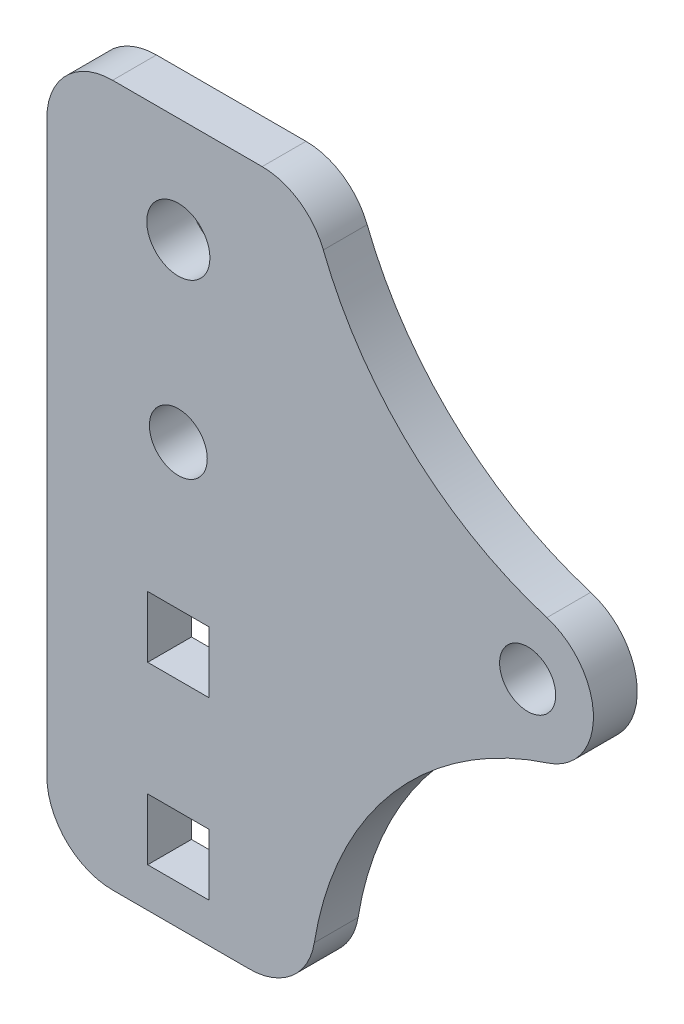
ISO-10303-21;
HEADER;
FILE_DESCRIPTION(('STEP AP214'),'2;1');
FILE_NAME('part.step','',(''),(''),'','','');
FILE_SCHEMA(('AUTOMOTIVE_DESIGN { 1 0 10303 214 1 1 1 1 }'));
ENDSEC;
DATA;
#1=APPLICATION_CONTEXT('core data for automotive mechanical design processes');
#2=APPLICATION_PROTOCOL_DEFINITION('international standard','automotive_design',2000,#1);
#3=PRODUCT_CONTEXT('',#1,'mechanical');
#4=PRODUCT('Part','Part','',(#3));
#5=PRODUCT_RELATED_PRODUCT_CATEGORY('part','',(#4));
#6=PRODUCT_DEFINITION_FORMATION('','',#4);
#7=PRODUCT_DEFINITION_CONTEXT('part definition',#1,'design');
#8=PRODUCT_DEFINITION('design','',#6,#7);
#9=PRODUCT_DEFINITION_SHAPE('','',#8);
#10=(LENGTH_UNIT() NAMED_UNIT(*) SI_UNIT(.MILLI.,.METRE.));
#11=(NAMED_UNIT(*) PLANE_ANGLE_UNIT() SI_UNIT($,.RADIAN.));
#12=(NAMED_UNIT(*) SI_UNIT($,.STERADIAN.) SOLID_ANGLE_UNIT());
#13=UNCERTAINTY_MEASURE_WITH_UNIT(LENGTH_MEASURE(1.E-05),#10,'distance_accuracy_value','');
#14=(GEOMETRIC_REPRESENTATION_CONTEXT(3) GLOBAL_UNCERTAINTY_ASSIGNED_CONTEXT((#13)) GLOBAL_UNIT_ASSIGNED_CONTEXT((#10,
#11,#12)) REPRESENTATION_CONTEXT('',''));
#15=CARTESIAN_POINT('',(0.,0.,0.));
#16=DIRECTION('',(0.,0.,1.));
#17=DIRECTION('',(1.,0.,0.));
#18=AXIS2_PLACEMENT_3D('',#15,#16,#17);
#19=CARTESIAN_POINT('',(34.4815029106175,-30.48,3.175));
#20=DIRECTION('',(0.,0.,-1.));
#21=DIRECTION('',(-1.,0.,0.));
#22=AXIS2_PLACEMENT_3D('',#19,#20,#21);
#23=PLANE('',#22);
#24=DIRECTION('',(0.,1.,0.));
#25=VECTOR('',#24,1.);
#26=CARTESIAN_POINT('',(2.2225,-27.6225,3.175));
#27=LINE('',#26,#25);
#28=CARTESIAN_POINT('',(2.2225,-27.6225,3.175));
#29=VERTEX_POINT('',#28);
#30=CARTESIAN_POINT('',(2.2225,-23.1775,3.175));
#31=VERTEX_POINT('',#30);
#32=EDGE_CURVE('E249',#29,#31,#27,.T.);
#33=ORIENTED_EDGE('',*,*,#32,.F.);
#34=DIRECTION('',(1.,0.,0.));
#35=VECTOR('',#34,1.);
#36=CARTESIAN_POINT('',(-2.2225,-27.6225,3.175));
#37=LINE('',#36,#35);
#38=CARTESIAN_POINT('',(-2.2225,-27.6225,3.175));
#39=VERTEX_POINT('',#38);
#40=EDGE_CURVE('E260',#39,#29,#37,.T.);
#41=ORIENTED_EDGE('',*,*,#40,.F.);
#42=DIRECTION('',(0.,-1.,0.));
#43=VECTOR('',#42,1.);
#44=CARTESIAN_POINT('',(-2.2225,-27.6225,3.175));
#45=LINE('',#44,#43);
#46=CARTESIAN_POINT('',(-2.2225,-23.1775,3.175));
#47=VERTEX_POINT('',#46);
#48=EDGE_CURVE('E256',#47,#39,#45,.T.);
#49=ORIENTED_EDGE('',*,*,#48,.F.);
#50=DIRECTION('',(-1.,0.,0.));
#51=VECTOR('',#50,1.);
#52=CARTESIAN_POINT('',(-2.2225,-23.1775,3.175));
#53=LINE('',#52,#51);
#54=EDGE_CURVE('E252',#31,#47,#53,.T.);
#55=ORIENTED_EDGE('',*,*,#54,.F.);
#56=EDGE_LOOP('',(#33,#41,#49,#55));
#57=FACE_BOUND('',#56,.T.);
#58=DIRECTION('',(0.,-1.,0.));
#59=VECTOR('',#58,1.);
#60=CARTESIAN_POINT('',(-9.525,-30.48,3.175));
#61=LINE('',#60,#59);
#62=CARTESIAN_POINT('',(-9.525,15.5575,3.175));
#63=VERTEX_POINT('',#62);
#64=CARTESIAN_POINT('',(-9.525,-25.7175,3.175));
#65=VERTEX_POINT('',#64);
#66=EDGE_CURVE('E331',#63,#65,#61,.T.);
#67=ORIENTED_EDGE('',*,*,#66,.T.);
#68=CARTESIAN_POINT('',(-4.76249999999999,-25.7175,3.175));
#69=DIRECTION('',(0.,0.,-1.));
#70=DIRECTION('',(-1.,0.,0.));
#71=AXIS2_PLACEMENT_3D('',#68,#69,#70);
#72=CIRCLE('',#71,4.7625);
#73=CARTESIAN_POINT('',(-4.76249999999999,-30.48,3.175));
#74=VERTEX_POINT('',#73);
#75=EDGE_CURVE('E389',#65,#74,#72,.F.);
#76=ORIENTED_EDGE('',*,*,#75,.T.);
#77=DIRECTION('',(1.,0.,0.));
#78=VECTOR('',#77,1.);
#79=CARTESIAN_POINT('',(-9.525,-30.48,3.175));
#80=LINE('',#79,#78);
#81=CARTESIAN_POINT('',(5.14657956401079,-30.48,3.175));
#82=VERTEX_POINT('',#81);
#83=EDGE_CURVE('E315',#74,#82,#80,.T.);
#84=ORIENTED_EDGE('',*,*,#83,.T.);
#85=CARTESIAN_POINT('',(5.14657956401079,-25.7175,3.175));
#86=DIRECTION('',(0.,0.,-1.));
#87=DIRECTION('',(-1.,0.,0.));
#88=AXIS2_PLACEMENT_3D('',#85,#86,#87);
#89=CIRCLE('',#88,4.7625);
#90=CARTESIAN_POINT('',(9.84753042896401,-26.4806953978475,3.175));
#91=VERTEX_POINT('',#90);
#92=EDGE_CURVE('E383',#82,#91,#89,.F.);
#93=ORIENTED_EDGE('',*,*,#92,.T.);
#94=CARTESIAN_POINT('',(34.4815029106175,-30.48,3.175));
#95=DIRECTION('',(0.,0.,-1.));
#96=DIRECTION('',(-1.,0.,0.));
#97=AXIS2_PLACEMENT_3D('',#94,#95,#96);
#98=CIRCLE('',#97,24.9565029106175);
#99=CARTESIAN_POINT('',(26.7741542816781,-6.74344981595585,3.175));
#100=VERTEX_POINT('',#99);
#101=EDGE_CURVE('E319',#91,#100,#98,.T.);
#102=ORIENTED_EDGE('',*,*,#101,.T.);
#103=CARTESIAN_POINT('',(25.3033453315303,-2.21375586579042,3.175));
#104=DIRECTION('',(0.,0.,1.));
#105=DIRECTION('',(1.,0.,0.));
#106=AXIS2_PLACEMENT_3D('',#103,#104,#105);
#107=CIRCLE('',#106,4.7625);
#108=CARTESIAN_POINT('',(26.6968842098427,2.34030338334457,3.175));
#109=VERTEX_POINT('',#108);
#110=EDGE_CURVE('E323',#100,#109,#107,.T.);
#111=ORIENTED_EDGE('',*,*,#110,.T.);
#112=CARTESIAN_POINT('',(34.129091560842,26.6286193787311,3.175));
#113=DIRECTION('',(0.,0.,-1.));
#114=DIRECTION('',(1.,0.,0.));
#115=AXIS2_PLACEMENT_3D('',#112,#113,#114);
#116=CIRCLE('',#115,25.4);
#117=CARTESIAN_POINT('',(10.5019720179554,17.3055714808523,3.175));
#118=VERTEX_POINT('',#117);
#119=EDGE_CURVE('E326',#109,#118,#116,.T.);
#120=ORIENTED_EDGE('',*,*,#119,.T.);
#121=CARTESIAN_POINT('',(6.07188710366412,15.5575,3.175));
#122=DIRECTION('',(0.,0.,-1.));
#123=DIRECTION('',(-1.,0.,0.));
#124=AXIS2_PLACEMENT_3D('',#121,#122,#123);
#125=CIRCLE('',#124,4.7625);
#126=CARTESIAN_POINT('',(6.07188710366412,20.32,3.175));
#127=VERTEX_POINT('',#126);
#128=EDGE_CURVE('E69',#118,#127,#125,.F.);
#129=ORIENTED_EDGE('',*,*,#128,.T.);
#130=DIRECTION('',(-1.,0.,0.));
#131=VECTOR('',#130,1.);
#132=CARTESIAN_POINT('',(-9.525,20.32,3.175));
#133=LINE('',#132,#131);
#134=CARTESIAN_POINT('',(-4.7625,20.32,3.175));
#135=VERTEX_POINT('',#134);
#136=EDGE_CURVE('E328',#127,#135,#133,.T.);
#137=ORIENTED_EDGE('',*,*,#136,.T.);
#138=CARTESIAN_POINT('',(-4.7625,15.5575,3.175));
#139=DIRECTION('',(0.,0.,-1.));
#140=DIRECTION('',(-1.,0.,0.));
#141=AXIS2_PLACEMENT_3D('',#138,#139,#140);
#142=CIRCLE('',#141,4.7625);
#143=EDGE_CURVE('E385',#135,#63,#142,.F.);
#144=ORIENTED_EDGE('',*,*,#143,.T.);
#145=EDGE_LOOP('',(#67,#76,#84,#93,#102,#111,#120,#129,#137,#144));
#146=FACE_BOUND('',#145,.T.);
#147=CARTESIAN_POINT('',(0.,0.,3.175));
#148=DIRECTION('',(0.,0.,1.));
#149=DIRECTION('',(1.,0.,0.));
#150=AXIS2_PLACEMENT_3D('',#147,#148,#149);
#151=CIRCLE('',#150,2.0955);
#152=CARTESIAN_POINT('',(2.0955,0.,3.175));
#153=VERTEX_POINT('',#152);
#154=EDGE_CURVE('E307',#153,#153,#151,.T.);
#155=ORIENTED_EDGE('',*,*,#154,.F.);
#156=EDGE_LOOP('',(#155));
#157=FACE_BOUND('',#156,.T.);
#158=CARTESIAN_POINT('',(25.3033453315303,-2.21375586579042,3.175));
#159=DIRECTION('',(0.,0.,1.));
#160=DIRECTION('',(1.,0.,0.));
#161=AXIS2_PLACEMENT_3D('',#158,#159,#160);
#162=CIRCLE('',#161,2.032);
#163=CARTESIAN_POINT('',(27.3353453315303,-2.21375586579042,3.175));
#164=VERTEX_POINT('',#163);
#165=EDGE_CURVE('E299',#164,#164,#162,.T.);
#166=ORIENTED_EDGE('',*,*,#165,.F.);
#167=EDGE_LOOP('',(#166));
#168=FACE_BOUND('',#167,.T.);
#169=CARTESIAN_POINT('',(0.,12.7,3.175));
#170=DIRECTION('',(0.,0.,1.));
#171=DIRECTION('',(1.,0.,0.));
#172=AXIS2_PLACEMENT_3D('',#169,#170,#171);
#173=CIRCLE('',#172,2.286);
#174=CARTESIAN_POINT('',(2.286,12.7,3.175));
#175=VERTEX_POINT('',#174);
#176=EDGE_CURVE('E291',#175,#175,#173,.T.);
#177=ORIENTED_EDGE('',*,*,#176,.F.);
#178=EDGE_LOOP('',(#177));
#179=FACE_BOUND('',#178,.T.);
#180=DIRECTION('',(0.,1.,0.));
#181=VECTOR('',#180,1.);
#182=CARTESIAN_POINT('',(2.2225,-14.9225,3.175));
#183=LINE('',#182,#181);
#184=CARTESIAN_POINT('',(2.2225,-14.9225,3.175));
#185=VERTEX_POINT('',#184);
#186=CARTESIAN_POINT('',(2.2225,-10.4775,3.175));
#187=VERTEX_POINT('',#186);
#188=EDGE_CURVE('E196',#185,#187,#183,.T.);
#189=ORIENTED_EDGE('',*,*,#188,.F.);
#190=DIRECTION('',(1.,0.,0.));
#191=VECTOR('',#190,1.);
#192=CARTESIAN_POINT('',(-2.2225,-14.9225,3.175));
#193=LINE('',#192,#191);
#194=CARTESIAN_POINT('',(-2.2225,-14.9225,3.175));
#195=VERTEX_POINT('',#194);
#196=EDGE_CURVE('E225',#195,#185,#193,.T.);
#197=ORIENTED_EDGE('',*,*,#196,.F.);
#198=DIRECTION('',(0.,-1.,0.));
#199=VECTOR('',#198,1.);
#200=CARTESIAN_POINT('',(-2.2225,-14.9225,3.175));
#201=LINE('',#200,#199);
#202=CARTESIAN_POINT('',(-2.2225,-10.4775,3.175));
#203=VERTEX_POINT('',#202);
#204=EDGE_CURVE('E221',#203,#195,#201,.T.);
#205=ORIENTED_EDGE('',*,*,#204,.F.);
#206=DIRECTION('',(-1.,0.,0.));
#207=VECTOR('',#206,1.);
#208=CARTESIAN_POINT('',(-2.2225,-10.4775,3.175));
#209=LINE('',#208,#207);
#210=EDGE_CURVE('E207',#187,#203,#209,.T.);
#211=ORIENTED_EDGE('',*,*,#210,.F.);
#212=EDGE_LOOP('',(#189,#197,#205,#211));
#213=FACE_BOUND('',#212,.T.);
#214=ADVANCED_FACE('F44',(#57,#146,#157,#168,#179,#213),#23,.F.);
#215=CARTESIAN_POINT('',(34.4815029106175,-30.48,0.));
#216=DIRECTION('',(0.,0.,-1.));
#217=DIRECTION('',(-1.,0.,0.));
#218=AXIS2_PLACEMENT_3D('',#215,#216,#217);
#219=PLANE('',#218);
#220=CARTESIAN_POINT('',(25.3033453315303,-2.21375586579042,0.));
#221=DIRECTION('',(0.,0.,1.));
#222=DIRECTION('',(1.,0.,0.));
#223=AXIS2_PLACEMENT_3D('',#220,#221,#222);
#224=CIRCLE('',#223,2.032);
#225=CARTESIAN_POINT('',(27.3353453315303,-2.21375586579042,0.));
#226=VERTEX_POINT('',#225);
#227=EDGE_CURVE('E295',#226,#226,#224,.T.);
#228=ORIENTED_EDGE('',*,*,#227,.T.);
#229=EDGE_LOOP('',(#228));
#230=FACE_BOUND('',#229,.T.);
#231=DIRECTION('',(1.,0.,0.));
#232=VECTOR('',#231,1.);
#233=CARTESIAN_POINT('',(-9.525,-30.48,0.));
#234=LINE('',#233,#232);
#235=CARTESIAN_POINT('',(-4.76249999999999,-30.48,0.));
#236=VERTEX_POINT('',#235);
#237=CARTESIAN_POINT('',(5.14657956401079,-30.48,0.));
#238=VERTEX_POINT('',#237);
#239=EDGE_CURVE('E311',#236,#238,#234,.T.);
#240=ORIENTED_EDGE('',*,*,#239,.F.);
#241=CARTESIAN_POINT('',(-4.76249999999999,-25.7175,0.));
#242=DIRECTION('',(0.,0.,-1.));
#243=DIRECTION('',(-1.,0.,0.));
#244=AXIS2_PLACEMENT_3D('',#241,#242,#243);
#245=CIRCLE('',#244,4.7625);
#246=CARTESIAN_POINT('',(-9.525,-25.7175,0.));
#247=VERTEX_POINT('',#246);
#248=EDGE_CURVE('E373',#236,#247,#245,.T.);
#249=ORIENTED_EDGE('',*,*,#248,.T.);
#250=DIRECTION('',(0.,-1.,0.));
#251=VECTOR('',#250,1.);
#252=CARTESIAN_POINT('',(-9.525,-30.48,0.));
#253=LINE('',#252,#251);
#254=CARTESIAN_POINT('',(-9.525,15.5575,0.));
#255=VERTEX_POINT('',#254);
#256=EDGE_CURVE('E320',#255,#247,#253,.T.);
#257=ORIENTED_EDGE('',*,*,#256,.F.);
#258=CARTESIAN_POINT('',(-4.7625,15.5575,0.));
#259=DIRECTION('',(0.,0.,-1.));
#260=DIRECTION('',(-1.,0.,0.));
#261=AXIS2_PLACEMENT_3D('',#258,#259,#260);
#262=CIRCLE('',#261,4.7625);
#263=CARTESIAN_POINT('',(-4.7625,20.32,0.));
#264=VERTEX_POINT('',#263);
#265=EDGE_CURVE('E368',#255,#264,#262,.T.);
#266=ORIENTED_EDGE('',*,*,#265,.T.);
#267=DIRECTION('',(-1.,0.,0.));
#268=VECTOR('',#267,1.);
#269=CARTESIAN_POINT('',(-9.525,20.32,0.));
#270=LINE('',#269,#268);
#271=CARTESIAN_POINT('',(6.07188710366412,20.32,0.));
#272=VERTEX_POINT('',#271);
#273=EDGE_CURVE('E348',#272,#264,#270,.T.);
#274=ORIENTED_EDGE('',*,*,#273,.F.);
#275=CARTESIAN_POINT('',(6.07188710366412,15.5575,0.));
#276=DIRECTION('',(0.,0.,-1.));
#277=DIRECTION('',(-1.,0.,0.));
#278=AXIS2_PLACEMENT_3D('',#275,#276,#277);
#279=CIRCLE('',#278,4.7625);
#280=CARTESIAN_POINT('',(10.5019720179554,17.3055714808523,0.));
#281=VERTEX_POINT('',#280);
#282=EDGE_CURVE('E371',#272,#281,#279,.T.);
#283=ORIENTED_EDGE('',*,*,#282,.T.);
#284=CARTESIAN_POINT('',(34.129091560842,26.6286193787311,0.));
#285=DIRECTION('',(0.,0.,-1.));
#286=DIRECTION('',(1.,0.,0.));
#287=AXIS2_PLACEMENT_3D('',#284,#285,#286);
#288=CIRCLE('',#287,25.4);
#289=CARTESIAN_POINT('',(26.6968842098427,2.34030338334457,0.));
#290=VERTEX_POINT('',#289);
#291=EDGE_CURVE('E345',#290,#281,#288,.T.);
#292=ORIENTED_EDGE('',*,*,#291,.F.);
#293=CARTESIAN_POINT('',(25.3033453315303,-2.21375586579042,0.));
#294=DIRECTION('',(0.,0.,1.));
#295=DIRECTION('',(1.,0.,0.));
#296=AXIS2_PLACEMENT_3D('',#293,#294,#295);
#297=CIRCLE('',#296,4.7625);
#298=CARTESIAN_POINT('',(26.7741542816781,-6.74344981595585,0.));
#299=VERTEX_POINT('',#298);
#300=EDGE_CURVE('E342',#299,#290,#297,.T.);
#301=ORIENTED_EDGE('',*,*,#300,.F.);
#302=CARTESIAN_POINT('',(34.4815029106175,-30.48,0.));
#303=DIRECTION('',(0.,0.,-1.));
#304=DIRECTION('',(-1.,0.,0.));
#305=AXIS2_PLACEMENT_3D('',#302,#303,#304);
#306=CIRCLE('',#305,24.9565029106175);
#307=CARTESIAN_POINT('',(9.84753042896401,-26.4806953978475,0.));
#308=VERTEX_POINT('',#307);
#309=EDGE_CURVE('E339',#308,#299,#306,.T.);
#310=ORIENTED_EDGE('',*,*,#309,.F.);
#311=CARTESIAN_POINT('',(5.14657956401079,-25.7175,0.));
#312=DIRECTION('',(0.,0.,-1.));
#313=DIRECTION('',(-1.,0.,0.));
#314=AXIS2_PLACEMENT_3D('',#311,#312,#313);
#315=CIRCLE('',#314,4.7625);
#316=EDGE_CURVE('E366',#308,#238,#315,.T.);
#317=ORIENTED_EDGE('',*,*,#316,.T.);
#318=EDGE_LOOP('',(#240,#249,#257,#266,#274,#283,#292,#301,#310,#317));
#319=FACE_BOUND('',#318,.T.);
#320=CARTESIAN_POINT('',(0.,0.,0.));
#321=DIRECTION('',(0.,0.,1.));
#322=DIRECTION('',(1.,0.,0.));
#323=AXIS2_PLACEMENT_3D('',#320,#321,#322);
#324=CIRCLE('',#323,2.0955);
#325=CARTESIAN_POINT('',(2.0955,0.,0.));
#326=VERTEX_POINT('',#325);
#327=EDGE_CURVE('E303',#326,#326,#324,.T.);
#328=ORIENTED_EDGE('',*,*,#327,.T.);
#329=EDGE_LOOP('',(#328));
#330=FACE_BOUND('',#329,.T.);
#331=CARTESIAN_POINT('',(0.,12.7,0.));
#332=DIRECTION('',(0.,0.,1.));
#333=DIRECTION('',(1.,0.,0.));
#334=AXIS2_PLACEMENT_3D('',#331,#332,#333);
#335=CIRCLE('',#334,2.286);
#336=CARTESIAN_POINT('',(2.286,12.7,0.));
#337=VERTEX_POINT('',#336);
#338=EDGE_CURVE('E290',#337,#337,#335,.T.);
#339=ORIENTED_EDGE('',*,*,#338,.T.);
#340=EDGE_LOOP('',(#339));
#341=FACE_BOUND('',#340,.T.);
#342=DIRECTION('',(1.,0.,0.));
#343=VECTOR('',#342,1.);
#344=CARTESIAN_POINT('',(-2.2225,-27.6225,0.));
#345=LINE('',#344,#343);
#346=CARTESIAN_POINT('',(-2.2225,-27.6225,0.));
#347=VERTEX_POINT('',#346);
#348=CARTESIAN_POINT('',(2.2225,-27.6225,0.));
#349=VERTEX_POINT('',#348);
#350=EDGE_CURVE('E253',#347,#349,#345,.T.);
#351=ORIENTED_EDGE('',*,*,#350,.T.);
#352=DIRECTION('',(0.,1.,0.));
#353=VECTOR('',#352,1.);
#354=CARTESIAN_POINT('',(2.2225,-27.6225,0.));
#355=LINE('',#354,#353);
#356=CARTESIAN_POINT('',(2.2225,-23.1775,0.));
#357=VERTEX_POINT('',#356);
#358=EDGE_CURVE('E216',#349,#357,#355,.T.);
#359=ORIENTED_EDGE('',*,*,#358,.T.);
#360=DIRECTION('',(-1.,0.,0.));
#361=VECTOR('',#360,1.);
#362=CARTESIAN_POINT('',(-2.2225,-23.1775,0.));
#363=LINE('',#362,#361);
#364=CARTESIAN_POINT('',(-2.2225,-23.1775,0.));
#365=VERTEX_POINT('',#364);
#366=EDGE_CURVE('E267',#357,#365,#363,.T.);
#367=ORIENTED_EDGE('',*,*,#366,.T.);
#368=DIRECTION('',(0.,-1.,0.));
#369=VECTOR('',#368,1.);
#370=CARTESIAN_POINT('',(-2.2225,-27.6225,0.));
#371=LINE('',#370,#369);
#372=EDGE_CURVE('E271',#365,#347,#371,.T.);
#373=ORIENTED_EDGE('',*,*,#372,.T.);
#374=EDGE_LOOP('',(#351,#359,#367,#373));
#375=FACE_BOUND('',#374,.T.);
#376=DIRECTION('',(1.,0.,0.));
#377=VECTOR('',#376,1.);
#378=CARTESIAN_POINT('',(-2.2225,-14.9225,0.));
#379=LINE('',#378,#377);
#380=CARTESIAN_POINT('',(-2.2225,-14.9225,0.));
#381=VERTEX_POINT('',#380);
#382=CARTESIAN_POINT('',(2.2225,-14.9225,0.));
#383=VERTEX_POINT('',#382);
#384=EDGE_CURVE('E208',#381,#383,#379,.T.);
#385=ORIENTED_EDGE('',*,*,#384,.T.);
#386=DIRECTION('',(0.,1.,0.));
#387=VECTOR('',#386,1.);
#388=CARTESIAN_POINT('',(2.2225,-14.9225,0.));
#389=LINE('',#388,#387);
#390=CARTESIAN_POINT('',(2.2225,-10.4775,0.));
#391=VERTEX_POINT('',#390);
#392=EDGE_CURVE('E230',#383,#391,#389,.T.);
#393=ORIENTED_EDGE('',*,*,#392,.T.);
#394=DIRECTION('',(-1.,0.,0.));
#395=VECTOR('',#394,1.);
#396=CARTESIAN_POINT('',(-2.2225,-10.4775,0.));
#397=LINE('',#396,#395);
#398=CARTESIAN_POINT('',(-2.2225,-10.4775,0.));
#399=VERTEX_POINT('',#398);
#400=EDGE_CURVE('E214',#391,#399,#397,.T.);
#401=ORIENTED_EDGE('',*,*,#400,.T.);
#402=DIRECTION('',(0.,-1.,0.));
#403=VECTOR('',#402,1.);
#404=CARTESIAN_POINT('',(-2.2225,-14.9225,0.));
#405=LINE('',#404,#403);
#406=EDGE_CURVE('E235',#399,#381,#405,.T.);
#407=ORIENTED_EDGE('',*,*,#406,.T.);
#408=EDGE_LOOP('',(#385,#393,#401,#407));
#409=FACE_BOUND('',#408,.T.);
#410=ADVANCED_FACE('F411',(#230,#319,#330,#341,#375,#409),#219,.T.);
#411=CARTESIAN_POINT('',(-9.525,-30.48,3.175));
#412=DIRECTION('',(0.,1.,0.));
#413=DIRECTION('',(0.,0.,1.));
#414=AXIS2_PLACEMENT_3D('',#411,#412,#413);
#415=PLANE('',#414);
#416=ORIENTED_EDGE('',*,*,#83,.F.);
#417=DIRECTION('',(0.,0.,-1.));
#418=VECTOR('',#417,1.);
#419=CARTESIAN_POINT('',(-4.76249999999999,-30.48,3.175));
#420=LINE('',#419,#418);
#421=EDGE_CURVE('E362',#74,#236,#420,.T.);
#422=ORIENTED_EDGE('',*,*,#421,.T.);
#423=ORIENTED_EDGE('',*,*,#239,.T.);
#424=DIRECTION('',(0.,0.,-1.));
#425=VECTOR('',#424,1.);
#426=CARTESIAN_POINT('',(5.14657956401079,-30.48,3.175));
#427=LINE('',#426,#425);
#428=EDGE_CURVE('E360',#238,#82,#427,.F.);
#429=ORIENTED_EDGE('',*,*,#428,.T.);
#430=EDGE_LOOP('',(#416,#422,#423,#429));
#431=FACE_BOUND('',#430,.T.);
#432=ADVANCED_FACE('F428',(#431),#415,.F.);
#433=CARTESIAN_POINT('',(34.4815029106175,-30.48,3.175));
#434=DIRECTION('',(0.,0.,-1.));
#435=DIRECTION('',(-1.,0.,0.));
#436=AXIS2_PLACEMENT_3D('',#433,#434,#435);
#437=CYLINDRICAL_SURFACE('',#436,24.9565029106175);
#438=ORIENTED_EDGE('',*,*,#101,.F.);
#439=DIRECTION('',(0.,0.,-1.));
#440=VECTOR('',#439,1.);
#441=CARTESIAN_POINT('',(9.84753042896401,-26.4806953978475,3.175));
#442=LINE('',#441,#440);
#443=EDGE_CURVE('E11',#91,#308,#442,.T.);
#444=ORIENTED_EDGE('',*,*,#443,.T.);
#445=ORIENTED_EDGE('',*,*,#309,.T.);
#446=DIRECTION('',(0.,0.,-1.));
#447=VECTOR('',#446,1.);
#448=CARTESIAN_POINT('',(26.7741542816781,-6.74344981595585,3.175));
#449=LINE('',#448,#447);
#450=EDGE_CURVE('E356',#100,#299,#449,.T.);
#451=ORIENTED_EDGE('',*,*,#450,.F.);
#452=EDGE_LOOP('',(#438,#444,#445,#451));
#453=FACE_BOUND('',#452,.T.);
#454=ADVANCED_FACE('F437',(#453),#437,.F.);
#455=CARTESIAN_POINT('',(25.3033453315303,-2.21375586579042,3.175));
#456=DIRECTION('',(0.,0.,-1.));
#457=DIRECTION('',(-1.,0.,0.));
#458=AXIS2_PLACEMENT_3D('',#455,#456,#457);
#459=CYLINDRICAL_SURFACE('',#458,4.7625);
#460=ORIENTED_EDGE('',*,*,#300,.T.);
#461=DIRECTION('',(0.,0.,-1.));
#462=VECTOR('',#461,1.);
#463=CARTESIAN_POINT('',(26.6968842098427,2.34030338334457,3.175));
#464=LINE('',#463,#462);
#465=EDGE_CURVE('E335',#109,#290,#464,.T.);
#466=ORIENTED_EDGE('',*,*,#465,.F.);
#467=ORIENTED_EDGE('',*,*,#110,.F.);
#468=ORIENTED_EDGE('',*,*,#450,.T.);
#469=EDGE_LOOP('',(#460,#466,#467,#468));
#470=FACE_BOUND('',#469,.T.);
#471=ADVANCED_FACE('F440',(#470),#459,.T.);
#472=CARTESIAN_POINT('',(34.129091560842,26.6286193787311,3.175));
#473=DIRECTION('',(0.,0.,-1.));
#474=DIRECTION('',(-1.,0.,0.));
#475=AXIS2_PLACEMENT_3D('',#472,#473,#474);
#476=CYLINDRICAL_SURFACE('',#475,25.4);
#477=ORIENTED_EDGE('',*,*,#291,.T.);
#478=DIRECTION('',(0.,0.,-1.));
#479=VECTOR('',#478,1.);
#480=CARTESIAN_POINT('',(10.5019720179554,17.3055714808523,3.175));
#481=LINE('',#480,#479);
#482=EDGE_CURVE('E52',#281,#118,#481,.F.);
#483=ORIENTED_EDGE('',*,*,#482,.T.);
#484=ORIENTED_EDGE('',*,*,#119,.F.);
#485=ORIENTED_EDGE('',*,*,#465,.T.);
#486=EDGE_LOOP('',(#477,#483,#484,#485));
#487=FACE_BOUND('',#486,.T.);
#488=ADVANCED_FACE('F399',(#487),#476,.F.);
#489=CARTESIAN_POINT('',(-9.525,20.32,3.175));
#490=DIRECTION('',(0.,-1.,0.));
#491=DIRECTION('',(0.,0.,-1.));
#492=AXIS2_PLACEMENT_3D('',#489,#490,#491);
#493=PLANE('',#492);
#494=ORIENTED_EDGE('',*,*,#136,.F.);
#495=DIRECTION('',(0.,0.,-1.));
#496=VECTOR('',#495,1.);
#497=CARTESIAN_POINT('',(6.07188710366412,20.32,3.175));
#498=LINE('',#497,#496);
#499=EDGE_CURVE('E394',#127,#272,#498,.T.);
#500=ORIENTED_EDGE('',*,*,#499,.T.);
#501=ORIENTED_EDGE('',*,*,#273,.T.);
#502=DIRECTION('',(0.,0.,-1.));
#503=VECTOR('',#502,1.);
#504=CARTESIAN_POINT('',(-4.7625,20.32,3.175));
#505=LINE('',#504,#503);
#506=EDGE_CURVE('E62',#264,#135,#505,.F.);
#507=ORIENTED_EDGE('',*,*,#506,.T.);
#508=EDGE_LOOP('',(#494,#500,#501,#507));
#509=FACE_BOUND('',#508,.T.);
#510=ADVANCED_FACE('F408',(#509),#493,.F.);
#511=CARTESIAN_POINT('',(-9.525,-30.48,3.175));
#512=DIRECTION('',(1.,0.,0.));
#513=DIRECTION('',(0.,1.,0.));
#514=AXIS2_PLACEMENT_3D('',#511,#512,#513);
#515=PLANE('',#514);
#516=ORIENTED_EDGE('',*,*,#256,.T.);
#517=DIRECTION('',(0.,0.,-1.));
#518=VECTOR('',#517,1.);
#519=CARTESIAN_POINT('',(-9.525,-25.7175,3.175));
#520=LINE('',#519,#518);
#521=EDGE_CURVE('E380',#247,#65,#520,.F.);
#522=ORIENTED_EDGE('',*,*,#521,.T.);
#523=ORIENTED_EDGE('',*,*,#66,.F.);
#524=DIRECTION('',(0.,0.,-1.));
#525=VECTOR('',#524,1.);
#526=CARTESIAN_POINT('',(-9.525,15.5575,3.175));
#527=LINE('',#526,#525);
#528=EDGE_CURVE('E376',#63,#255,#527,.T.);
#529=ORIENTED_EDGE('',*,*,#528,.T.);
#530=EDGE_LOOP('',(#516,#522,#523,#529));
#531=FACE_BOUND('',#530,.T.);
#532=ADVANCED_FACE('F420',(#531),#515,.F.);
#533=CARTESIAN_POINT('',(0.,0.,3.175));
#534=DIRECTION('',(0.,0.,-1.));
#535=DIRECTION('',(-1.,0.,0.));
#536=AXIS2_PLACEMENT_3D('',#533,#534,#535);
#537=CYLINDRICAL_SURFACE('',#536,2.0955);
#538=ORIENTED_EDGE('',*,*,#154,.T.);
#539=EDGE_LOOP('',(#538));
#540=FACE_BOUND('',#539,.T.);
#541=ORIENTED_EDGE('',*,*,#327,.F.);
#542=EDGE_LOOP('',(#541));
#543=FACE_BOUND('',#542,.T.);
#544=ADVANCED_FACE('F459',(#540,#543),#537,.F.);
#545=CARTESIAN_POINT('',(25.3033453315303,-2.21375586579042,3.175));
#546=DIRECTION('',(0.,0.,-1.));
#547=DIRECTION('',(-1.,0.,0.));
#548=AXIS2_PLACEMENT_3D('',#545,#546,#547);
#549=CYLINDRICAL_SURFACE('',#548,2.032);
#550=ORIENTED_EDGE('',*,*,#165,.T.);
#551=EDGE_LOOP('',(#550));
#552=FACE_BOUND('',#551,.T.);
#553=ORIENTED_EDGE('',*,*,#227,.F.);
#554=EDGE_LOOP('',(#553));
#555=FACE_BOUND('',#554,.T.);
#556=ADVANCED_FACE('F582',(#552,#555),#549,.F.);
#557=CARTESIAN_POINT('',(0.,12.7,3.175));
#558=DIRECTION('',(0.,0.,-1.));
#559=DIRECTION('',(-1.,0.,0.));
#560=AXIS2_PLACEMENT_3D('',#557,#558,#559);
#561=CYLINDRICAL_SURFACE('',#560,2.286);
#562=ORIENTED_EDGE('',*,*,#176,.T.);
#563=EDGE_LOOP('',(#562));
#564=FACE_BOUND('',#563,.T.);
#565=ORIENTED_EDGE('',*,*,#338,.F.);
#566=EDGE_LOOP('',(#565));
#567=FACE_BOUND('',#566,.T.);
#568=ADVANCED_FACE('F573',(#564,#567),#561,.F.);
#569=CARTESIAN_POINT('',(2.2225,-27.6225,3.175));
#570=DIRECTION('',(-1.,0.,0.));
#571=DIRECTION('',(0.,0.,1.));
#572=AXIS2_PLACEMENT_3D('',#569,#570,#571);
#573=PLANE('',#572);
#574=ORIENTED_EDGE('',*,*,#358,.F.);
#575=DIRECTION('',(0.,0.,-1.));
#576=VECTOR('',#575,1.);
#577=CARTESIAN_POINT('',(2.2225,-27.6225,3.175));
#578=LINE('',#577,#576);
#579=EDGE_CURVE('E263',#29,#349,#578,.T.);
#580=ORIENTED_EDGE('',*,*,#579,.F.);
#581=ORIENTED_EDGE('',*,*,#32,.T.);
#582=DIRECTION('',(0.,0.,-1.));
#583=VECTOR('',#582,1.);
#584=CARTESIAN_POINT('',(2.2225,-23.1775,3.175));
#585=LINE('',#584,#583);
#586=EDGE_CURVE('E286',#31,#357,#585,.T.);
#587=ORIENTED_EDGE('',*,*,#586,.T.);
#588=EDGE_LOOP('',(#574,#580,#581,#587));
#589=FACE_BOUND('',#588,.T.);
#590=ADVANCED_FACE('F564',(#589),#573,.T.);
#591=CARTESIAN_POINT('',(-2.2225,-23.1775,3.175));
#592=DIRECTION('',(0.,-1.,0.));
#593=DIRECTION('',(0.,0.,-1.));
#594=AXIS2_PLACEMENT_3D('',#591,#592,#593);
#595=PLANE('',#594);
#596=ORIENTED_EDGE('',*,*,#366,.F.);
#597=ORIENTED_EDGE('',*,*,#586,.F.);
#598=ORIENTED_EDGE('',*,*,#54,.T.);
#599=DIRECTION('',(0.,0.,-1.));
#600=VECTOR('',#599,1.);
#601=CARTESIAN_POINT('',(-2.2225,-23.1775,3.175));
#602=LINE('',#601,#600);
#603=EDGE_CURVE('E283',#47,#365,#602,.T.);
#604=ORIENTED_EDGE('',*,*,#603,.T.);
#605=EDGE_LOOP('',(#596,#597,#598,#604));
#606=FACE_BOUND('',#605,.T.);
#607=ADVANCED_FACE('F555',(#606),#595,.T.);
#608=CARTESIAN_POINT('',(-2.2225,-27.6225,3.175));
#609=DIRECTION('',(1.,0.,0.));
#610=DIRECTION('',(0.,0.,-1.));
#611=AXIS2_PLACEMENT_3D('',#608,#609,#610);
#612=PLANE('',#611);
#613=ORIENTED_EDGE('',*,*,#372,.F.);
#614=ORIENTED_EDGE('',*,*,#603,.F.);
#615=ORIENTED_EDGE('',*,*,#48,.T.);
#616=DIRECTION('',(0.,0.,-1.));
#617=VECTOR('',#616,1.);
#618=CARTESIAN_POINT('',(-2.2225,-27.6225,3.175));
#619=LINE('',#618,#617);
#620=EDGE_CURVE('E280',#39,#347,#619,.T.);
#621=ORIENTED_EDGE('',*,*,#620,.T.);
#622=EDGE_LOOP('',(#613,#614,#615,#621));
#623=FACE_BOUND('',#622,.T.);
#624=ADVANCED_FACE('F546',(#623),#612,.T.);
#625=CARTESIAN_POINT('',(-2.2225,-27.6225,3.175));
#626=DIRECTION('',(0.,1.,0.));
#627=DIRECTION('',(0.,0.,1.));
#628=AXIS2_PLACEMENT_3D('',#625,#626,#627);
#629=PLANE('',#628);
#630=ORIENTED_EDGE('',*,*,#350,.F.);
#631=ORIENTED_EDGE('',*,*,#620,.F.);
#632=ORIENTED_EDGE('',*,*,#40,.T.);
#633=ORIENTED_EDGE('',*,*,#579,.T.);
#634=EDGE_LOOP('',(#630,#631,#632,#633));
#635=FACE_BOUND('',#634,.T.);
#636=ADVANCED_FACE('F538',(#635),#629,.T.);
#637=CARTESIAN_POINT('',(2.2225,-14.9225,3.175));
#638=DIRECTION('',(-1.,0.,0.));
#639=DIRECTION('',(0.,0.,1.));
#640=AXIS2_PLACEMENT_3D('',#637,#638,#639);
#641=PLANE('',#640);
#642=ORIENTED_EDGE('',*,*,#392,.F.);
#643=DIRECTION('',(0.,0.,-1.));
#644=VECTOR('',#643,1.);
#645=CARTESIAN_POINT('',(2.2225,-14.9225,3.175));
#646=LINE('',#645,#644);
#647=EDGE_CURVE('E202',#185,#383,#646,.T.);
#648=ORIENTED_EDGE('',*,*,#647,.F.);
#649=ORIENTED_EDGE('',*,*,#188,.T.);
#650=DIRECTION('',(0.,0.,-1.));
#651=VECTOR('',#650,1.);
#652=CARTESIAN_POINT('',(2.2225,-10.4775,3.175));
#653=LINE('',#652,#651);
#654=EDGE_CURVE('E199',#187,#391,#653,.T.);
#655=ORIENTED_EDGE('',*,*,#654,.T.);
#656=EDGE_LOOP('',(#642,#648,#649,#655));
#657=FACE_BOUND('',#656,.T.);
#658=ADVANCED_FACE('F198',(#657),#641,.T.);
#659=CARTESIAN_POINT('',(-2.2225,-10.4775,3.175));
#660=DIRECTION('',(0.,-1.,0.));
#661=DIRECTION('',(0.,0.,-1.));
#662=AXIS2_PLACEMENT_3D('',#659,#660,#661);
#663=PLANE('',#662);
#664=ORIENTED_EDGE('',*,*,#400,.F.);
#665=ORIENTED_EDGE('',*,*,#654,.F.);
#666=ORIENTED_EDGE('',*,*,#210,.T.);
#667=DIRECTION('',(0.,0.,-1.));
#668=VECTOR('',#667,1.);
#669=CARTESIAN_POINT('',(-2.2225,-10.4775,3.175));
#670=LINE('',#669,#668);
#671=EDGE_CURVE('E217',#203,#399,#670,.T.);
#672=ORIENTED_EDGE('',*,*,#671,.T.);
#673=EDGE_LOOP('',(#664,#665,#666,#672));
#674=FACE_BOUND('',#673,.T.);
#675=ADVANCED_FACE('F211',(#674),#663,.T.);
#676=CARTESIAN_POINT('',(-2.2225,-14.9225,3.175));
#677=DIRECTION('',(1.,0.,0.));
#678=DIRECTION('',(0.,0.,-1.));
#679=AXIS2_PLACEMENT_3D('',#676,#677,#678);
#680=PLANE('',#679);
#681=ORIENTED_EDGE('',*,*,#406,.F.);
#682=ORIENTED_EDGE('',*,*,#671,.F.);
#683=ORIENTED_EDGE('',*,*,#204,.T.);
#684=DIRECTION('',(0.,0.,-1.));
#685=VECTOR('',#684,1.);
#686=CARTESIAN_POINT('',(-2.2225,-14.9225,3.175));
#687=LINE('',#686,#685);
#688=EDGE_CURVE('E244',#195,#381,#687,.T.);
#689=ORIENTED_EDGE('',*,*,#688,.T.);
#690=EDGE_LOOP('',(#681,#682,#683,#689));
#691=FACE_BOUND('',#690,.T.);
#692=ADVANCED_FACE('F514',(#691),#680,.T.);
#693=CARTESIAN_POINT('',(-2.2225,-14.9225,3.175));
#694=DIRECTION('',(0.,1.,0.));
#695=DIRECTION('',(0.,0.,1.));
#696=AXIS2_PLACEMENT_3D('',#693,#694,#695);
#697=PLANE('',#696);
#698=ORIENTED_EDGE('',*,*,#384,.F.);
#699=ORIENTED_EDGE('',*,*,#688,.F.);
#700=ORIENTED_EDGE('',*,*,#196,.T.);
#701=ORIENTED_EDGE('',*,*,#647,.T.);
#702=EDGE_LOOP('',(#698,#699,#700,#701));
#703=FACE_BOUND('',#702,.T.);
#704=ADVANCED_FACE('F482',(#703),#697,.T.);
#705=CARTESIAN_POINT('',(-4.76249999999999,-25.7175,3.175));
#706=DIRECTION('',(0.,0.,-1.));
#707=DIRECTION('',(-1.,0.,0.));
#708=AXIS2_PLACEMENT_3D('',#705,#706,#707);
#709=CYLINDRICAL_SURFACE('',#708,4.7625);
#710=ORIENTED_EDGE('',*,*,#75,.F.);
#711=ORIENTED_EDGE('',*,*,#521,.F.);
#712=ORIENTED_EDGE('',*,*,#248,.F.);
#713=ORIENTED_EDGE('',*,*,#421,.F.);
#714=EDGE_LOOP('',(#710,#711,#712,#713));
#715=FACE_BOUND('',#714,.T.);
#716=ADVANCED_FACE('F426',(#715),#709,.T.);
#717=CARTESIAN_POINT('',(6.07188710366412,15.5575,3.175));
#718=DIRECTION('',(0.,0.,-1.));
#719=DIRECTION('',(-1.,0.,0.));
#720=AXIS2_PLACEMENT_3D('',#717,#718,#719);
#721=CYLINDRICAL_SURFACE('',#720,4.7625);
#722=ORIENTED_EDGE('',*,*,#128,.F.);
#723=ORIENTED_EDGE('',*,*,#482,.F.);
#724=ORIENTED_EDGE('',*,*,#282,.F.);
#725=ORIENTED_EDGE('',*,*,#499,.F.);
#726=EDGE_LOOP('',(#722,#723,#724,#725));
#727=FACE_BOUND('',#726,.T.);
#728=ADVANCED_FACE('F406',(#727),#721,.T.);
#729=CARTESIAN_POINT('',(-4.7625,15.5575,3.175));
#730=DIRECTION('',(0.,0.,-1.));
#731=DIRECTION('',(-1.,0.,0.));
#732=AXIS2_PLACEMENT_3D('',#729,#730,#731);
#733=CYLINDRICAL_SURFACE('',#732,4.7625);
#734=ORIENTED_EDGE('',*,*,#143,.F.);
#735=ORIENTED_EDGE('',*,*,#506,.F.);
#736=ORIENTED_EDGE('',*,*,#265,.F.);
#737=ORIENTED_EDGE('',*,*,#528,.F.);
#738=EDGE_LOOP('',(#734,#735,#736,#737));
#739=FACE_BOUND('',#738,.T.);
#740=ADVANCED_FACE('F417',(#739),#733,.T.);
#741=CARTESIAN_POINT('',(5.14657956401079,-25.7175,3.175));
#742=DIRECTION('',(0.,0.,-1.));
#743=DIRECTION('',(-1.,0.,0.));
#744=AXIS2_PLACEMENT_3D('',#741,#742,#743);
#745=CYLINDRICAL_SURFACE('',#744,4.7625);
#746=ORIENTED_EDGE('',*,*,#92,.F.);
#747=ORIENTED_EDGE('',*,*,#428,.F.);
#748=ORIENTED_EDGE('',*,*,#316,.F.);
#749=ORIENTED_EDGE('',*,*,#443,.F.);
#750=EDGE_LOOP('',(#746,#747,#748,#749));
#751=FACE_BOUND('',#750,.T.);
#752=ADVANCED_FACE('F46',(#751),#745,.T.);
#753=CLOSED_SHELL('',(#214,#410,#432,#454,#471,#488,#510,#532,#544,#556,#568,#590,#607,#624,
#636,#658,#675,#692,#704,#716,#728,#740,#752));
#754=MANIFOLD_SOLID_BREP('B2',#753);
#755=ADVANCED_BREP_SHAPE_REPRESENTATION('',(#18,#754),#14);
#756=SHAPE_DEFINITION_REPRESENTATION(#9,#755);
ENDSEC;
END-ISO-10303-21;
